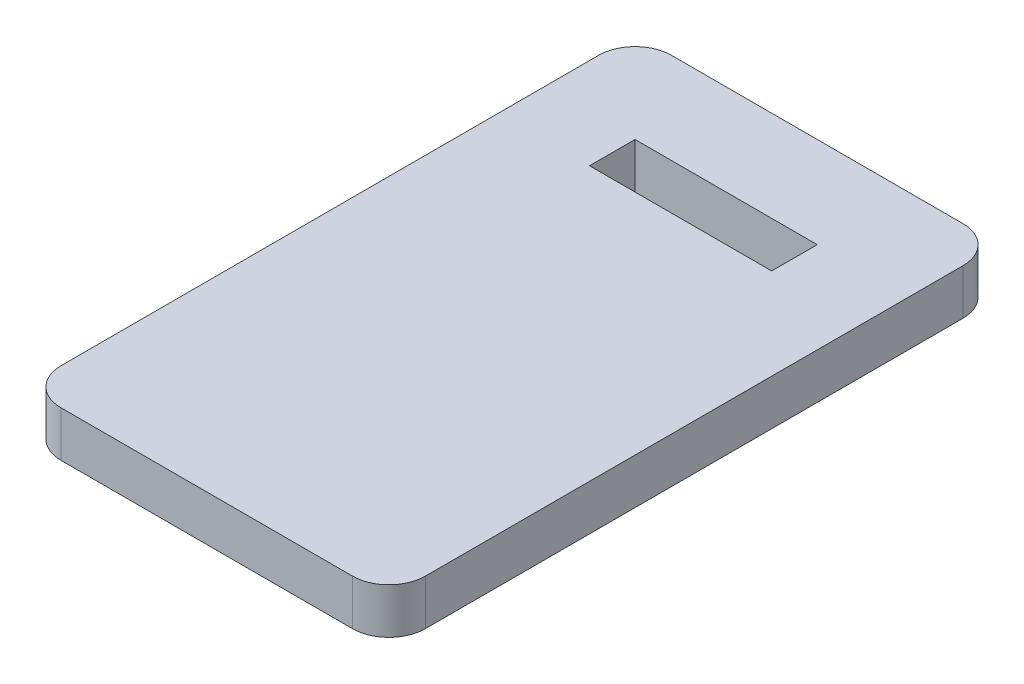
ISO-10303-21;
HEADER;
FILE_DESCRIPTION(('STEP AP214'),'2;1');
FILE_NAME('part.step','',(''),(''),'','','');
FILE_SCHEMA(('AUTOMOTIVE_DESIGN { 1 0 10303 214 1 1 1 1 }'));
ENDSEC;
DATA;
#1=APPLICATION_CONTEXT('core data for automotive mechanical design processes');
#2=APPLICATION_PROTOCOL_DEFINITION('international standard','automotive_design',2000,#1);
#3=PRODUCT_CONTEXT('',#1,'mechanical');
#4=PRODUCT('Part','Part','',(#3));
#5=PRODUCT_RELATED_PRODUCT_CATEGORY('part','',(#4));
#6=PRODUCT_DEFINITION_FORMATION('','',#4);
#7=PRODUCT_DEFINITION_CONTEXT('part definition',#1,'design');
#8=PRODUCT_DEFINITION('design','',#6,#7);
#9=PRODUCT_DEFINITION_SHAPE('','',#8);
#10=(LENGTH_UNIT() NAMED_UNIT(*) SI_UNIT(.MILLI.,.METRE.));
#11=(NAMED_UNIT(*) PLANE_ANGLE_UNIT() SI_UNIT($,.RADIAN.));
#12=(NAMED_UNIT(*) SI_UNIT($,.STERADIAN.) SOLID_ANGLE_UNIT());
#13=UNCERTAINTY_MEASURE_WITH_UNIT(LENGTH_MEASURE(1.E-05),#10,'distance_accuracy_value','');
#14=(GEOMETRIC_REPRESENTATION_CONTEXT(3) GLOBAL_UNCERTAINTY_ASSIGNED_CONTEXT((#13)) GLOBAL_UNIT_ASSIGNED_CONTEXT((#10,
#11,#12)) REPRESENTATION_CONTEXT('',''));
#15=CARTESIAN_POINT('',(0.,0.,0.));
#16=DIRECTION('',(0.,0.,1.));
#17=DIRECTION('',(1.,0.,0.));
#18=AXIS2_PLACEMENT_3D('',#15,#16,#17);
#19=CARTESIAN_POINT('',(0.,3.175,0.));
#20=DIRECTION('',(1.,0.,0.));
#21=DIRECTION('',(0.,0.,-1.));
#22=AXIS2_PLACEMENT_3D('',#19,#20,#21);
#23=PLANE('',#22);
#24=DIRECTION('',(0.,0.,1.));
#25=VECTOR('',#24,1.);
#26=CARTESIAN_POINT('',(0.,3.175,0.));
#27=LINE('',#26,#25);
#28=CARTESIAN_POINT('',(0.,3.175,-40.015));
#29=VERTEX_POINT('',#28);
#30=CARTESIAN_POINT('',(0.,3.175,-2.54));
#31=VERTEX_POINT('',#30);
#32=EDGE_CURVE('E190',#29,#31,#27,.T.);
#33=ORIENTED_EDGE('',*,*,#32,.F.);
#34=DIRECTION('',(0.,-1.,0.));
#35=VECTOR('',#34,1.);
#36=CARTESIAN_POINT('',(0.,3.175,-40.015));
#37=LINE('',#36,#35);
#38=CARTESIAN_POINT('',(0.,0.,-40.015));
#39=VERTEX_POINT('',#38);
#40=EDGE_CURVE('E221',#29,#39,#37,.T.);
#41=ORIENTED_EDGE('',*,*,#40,.T.);
#42=DIRECTION('',(0.,0.,1.));
#43=VECTOR('',#42,1.);
#44=CARTESIAN_POINT('',(0.,0.,0.));
#45=LINE('',#44,#43);
#46=CARTESIAN_POINT('',(0.,0.,-2.54));
#47=VERTEX_POINT('',#46);
#48=EDGE_CURVE('E184',#39,#47,#45,.T.);
#49=ORIENTED_EDGE('',*,*,#48,.T.);
#50=DIRECTION('',(0.,-1.,0.));
#51=VECTOR('',#50,1.);
#52=CARTESIAN_POINT('',(0.,3.175,-2.54));
#53=LINE('',#52,#51);
#54=EDGE_CURVE('E205',#47,#31,#53,.F.);
#55=ORIENTED_EDGE('',*,*,#54,.T.);
#56=EDGE_LOOP('',(#33,#41,#49,#55));
#57=FACE_BOUND('',#56,.T.);
#58=ADVANCED_FACE('F43',(#57),#23,.F.);
#59=CARTESIAN_POINT('',(0.,3.175,0.));
#60=DIRECTION('',(0.,0.,-1.));
#61=DIRECTION('',(-1.,0.,0.));
#62=AXIS2_PLACEMENT_3D('',#59,#60,#61);
#63=PLANE('',#62);
#64=DIRECTION('',(1.,0.,0.));
#65=VECTOR('',#64,1.);
#66=CARTESIAN_POINT('',(0.,0.,0.));
#67=LINE('',#66,#65);
#68=CARTESIAN_POINT('',(2.54,0.,0.));
#69=VERTEX_POINT('',#68);
#70=CARTESIAN_POINT('',(22.86,0.,0.));
#71=VERTEX_POINT('',#70);
#72=EDGE_CURVE('E209',#69,#71,#67,.T.);
#73=ORIENTED_EDGE('',*,*,#72,.T.);
#74=DIRECTION('',(0.,-1.,0.));
#75=VECTOR('',#74,1.);
#76=CARTESIAN_POINT('',(22.86,3.175,0.));
#77=LINE('',#76,#75);
#78=CARTESIAN_POINT('',(22.86,3.175,0.));
#79=VERTEX_POINT('',#78);
#80=EDGE_CURVE('E11',#71,#79,#77,.F.);
#81=ORIENTED_EDGE('',*,*,#80,.T.);
#82=DIRECTION('',(1.,0.,0.));
#83=VECTOR('',#82,1.);
#84=CARTESIAN_POINT('',(0.,3.175,0.));
#85=LINE('',#84,#83);
#86=CARTESIAN_POINT('',(2.54,3.175,0.));
#87=VERTEX_POINT('',#86);
#88=EDGE_CURVE('E194',#87,#79,#85,.T.);
#89=ORIENTED_EDGE('',*,*,#88,.F.);
#90=DIRECTION('',(0.,-1.,0.));
#91=VECTOR('',#90,1.);
#92=CARTESIAN_POINT('',(2.54,3.175,0.));
#93=LINE('',#92,#91);
#94=EDGE_CURVE('E52',#87,#69,#93,.T.);
#95=ORIENTED_EDGE('',*,*,#94,.T.);
#96=EDGE_LOOP('',(#73,#81,#89,#95));
#97=FACE_BOUND('',#96,.T.);
#98=ADVANCED_FACE('F266',(#97),#63,.F.);
#99=CARTESIAN_POINT('',(25.4,3.175,0.));
#100=DIRECTION('',(-1.,0.,0.));
#101=DIRECTION('',(0.,0.,1.));
#102=AXIS2_PLACEMENT_3D('',#99,#100,#101);
#103=PLANE('',#102);
#104=DIRECTION('',(0.,0.,-1.));
#105=VECTOR('',#104,1.);
#106=CARTESIAN_POINT('',(25.4,0.,0.));
#107=LINE('',#106,#105);
#108=CARTESIAN_POINT('',(25.4,0.,-2.54));
#109=VERTEX_POINT('',#108);
#110=CARTESIAN_POINT('',(25.4,0.,-40.015));
#111=VERTEX_POINT('',#110);
#112=EDGE_CURVE('E213',#109,#111,#107,.T.);
#113=ORIENTED_EDGE('',*,*,#112,.T.);
#114=DIRECTION('',(0.,-1.,0.));
#115=VECTOR('',#114,1.);
#116=CARTESIAN_POINT('',(25.4,3.175,-40.015));
#117=LINE('',#116,#115);
#118=CARTESIAN_POINT('',(25.4,3.175,-40.015));
#119=VERTEX_POINT('',#118);
#120=EDGE_CURVE('E59',#111,#119,#117,.F.);
#121=ORIENTED_EDGE('',*,*,#120,.T.);
#122=DIRECTION('',(0.,0.,-1.));
#123=VECTOR('',#122,1.);
#124=CARTESIAN_POINT('',(25.4,3.175,0.));
#125=LINE('',#124,#123);
#126=CARTESIAN_POINT('',(25.4,3.175,-2.54));
#127=VERTEX_POINT('',#126);
#128=EDGE_CURVE('E198',#127,#119,#125,.T.);
#129=ORIENTED_EDGE('',*,*,#128,.F.);
#130=DIRECTION('',(0.,-1.,0.));
#131=VECTOR('',#130,1.);
#132=CARTESIAN_POINT('',(25.4,3.175,-2.54));
#133=LINE('',#132,#131);
#134=EDGE_CURVE('E255',#127,#109,#133,.T.);
#135=ORIENTED_EDGE('',*,*,#134,.T.);
#136=EDGE_LOOP('',(#113,#121,#129,#135));
#137=FACE_BOUND('',#136,.T.);
#138=ADVANCED_FACE('F275',(#137),#103,.F.);
#139=CARTESIAN_POINT('',(0.,3.175,-42.555));
#140=DIRECTION('',(0.,0.,1.));
#141=DIRECTION('',(1.,0.,0.));
#142=AXIS2_PLACEMENT_3D('',#139,#140,#141);
#143=PLANE('',#142);
#144=DIRECTION('',(-1.,0.,0.));
#145=VECTOR('',#144,1.);
#146=CARTESIAN_POINT('',(0.,0.,-42.555));
#147=LINE('',#146,#145);
#148=CARTESIAN_POINT('',(22.86,0.,-42.555));
#149=VERTEX_POINT('',#148);
#150=CARTESIAN_POINT('',(2.54,0.,-42.555));
#151=VERTEX_POINT('',#150);
#152=EDGE_CURVE('E195',#149,#151,#147,.T.);
#153=ORIENTED_EDGE('',*,*,#152,.T.);
#154=DIRECTION('',(0.,-1.,0.));
#155=VECTOR('',#154,1.);
#156=CARTESIAN_POINT('',(2.54,3.175,-42.555));
#157=LINE('',#156,#155);
#158=CARTESIAN_POINT('',(2.54,3.175,-42.555));
#159=VERTEX_POINT('',#158);
#160=EDGE_CURVE('E241',#151,#159,#157,.F.);
#161=ORIENTED_EDGE('',*,*,#160,.T.);
#162=DIRECTION('',(-1.,0.,0.));
#163=VECTOR('',#162,1.);
#164=CARTESIAN_POINT('',(0.,3.175,-42.555));
#165=LINE('',#164,#163);
#166=CARTESIAN_POINT('',(22.86,3.175,-42.555));
#167=VERTEX_POINT('',#166);
#168=EDGE_CURVE('E201',#167,#159,#165,.T.);
#169=ORIENTED_EDGE('',*,*,#168,.F.);
#170=DIRECTION('',(0.,-1.,0.));
#171=VECTOR('',#170,1.);
#172=CARTESIAN_POINT('',(22.86,3.175,-42.555));
#173=LINE('',#172,#171);
#174=EDGE_CURVE('E237',#167,#149,#173,.T.);
#175=ORIENTED_EDGE('',*,*,#174,.T.);
#176=EDGE_LOOP('',(#153,#161,#169,#175));
#177=FACE_BOUND('',#176,.T.);
#178=ADVANCED_FACE('F284',(#177),#143,.F.);
#179=CARTESIAN_POINT('',(0.,3.175,0.));
#180=DIRECTION('',(0.,-1.,0.));
#181=DIRECTION('',(0.,0.,-1.));
#182=AXIS2_PLACEMENT_3D('',#179,#180,#181);
#183=PLANE('',#182);
#184=DIRECTION('',(1.,0.,0.));
#185=VECTOR('',#184,1.);
#186=CARTESIAN_POINT('',(6.35,3.175,-33.03));
#187=LINE('',#186,#185);
#188=CARTESIAN_POINT('',(6.35,3.175,-33.03));
#189=VERTEX_POINT('',#188);
#190=CARTESIAN_POINT('',(19.05,3.175,-33.03));
#191=VERTEX_POINT('',#190);
#192=EDGE_CURVE('E175',#189,#191,#187,.T.);
#193=ORIENTED_EDGE('',*,*,#192,.F.);
#194=DIRECTION('',(0.,0.,1.));
#195=VECTOR('',#194,1.);
#196=CARTESIAN_POINT('',(6.35,3.175,-33.03));
#197=LINE('',#196,#195);
#198=CARTESIAN_POINT('',(6.35,3.175,-36.205));
#199=VERTEX_POINT('',#198);
#200=EDGE_CURVE('E141',#199,#189,#197,.T.);
#201=ORIENTED_EDGE('',*,*,#200,.F.);
#202=DIRECTION('',(-1.,0.,0.));
#203=VECTOR('',#202,1.);
#204=CARTESIAN_POINT('',(6.35,3.175,-36.205));
#205=LINE('',#204,#203);
#206=CARTESIAN_POINT('',(19.05,3.175,-36.205));
#207=VERTEX_POINT('',#206);
#208=EDGE_CURVE('E162',#207,#199,#205,.T.);
#209=ORIENTED_EDGE('',*,*,#208,.F.);
#210=DIRECTION('',(0.,0.,-1.));
#211=VECTOR('',#210,1.);
#212=CARTESIAN_POINT('',(19.05,3.175,-33.03));
#213=LINE('',#212,#211);
#214=EDGE_CURVE('E166',#191,#207,#213,.T.);
#215=ORIENTED_EDGE('',*,*,#214,.F.);
#216=EDGE_LOOP('',(#193,#201,#209,#215));
#217=FACE_BOUND('',#216,.T.);
#218=ORIENTED_EDGE('',*,*,#168,.T.);
#219=CARTESIAN_POINT('',(2.54,3.175,-40.015));
#220=DIRECTION('',(0.,-1.,0.));
#221=DIRECTION('',(0.,0.,-1.));
#222=AXIS2_PLACEMENT_3D('',#219,#220,#221);
#223=CIRCLE('',#222,2.54);
#224=EDGE_CURVE('E252',#159,#29,#223,.F.);
#225=ORIENTED_EDGE('',*,*,#224,.T.);
#226=ORIENTED_EDGE('',*,*,#32,.T.);
#227=CARTESIAN_POINT('',(2.54,3.175,-2.54));
#228=DIRECTION('',(0.,-1.,0.));
#229=DIRECTION('',(0.,0.,-1.));
#230=AXIS2_PLACEMENT_3D('',#227,#228,#229);
#231=CIRCLE('',#230,2.54);
#232=EDGE_CURVE('E244',#31,#87,#231,.F.);
#233=ORIENTED_EDGE('',*,*,#232,.T.);
#234=ORIENTED_EDGE('',*,*,#88,.T.);
#235=CARTESIAN_POINT('',(22.86,3.175,-2.54));
#236=DIRECTION('',(0.,-1.,0.));
#237=DIRECTION('',(0.,0.,-1.));
#238=AXIS2_PLACEMENT_3D('',#235,#236,#237);
#239=CIRCLE('',#238,2.54);
#240=EDGE_CURVE('E66',#79,#127,#239,.F.);
#241=ORIENTED_EDGE('',*,*,#240,.T.);
#242=ORIENTED_EDGE('',*,*,#128,.T.);
#243=CARTESIAN_POINT('',(22.86,3.175,-40.015));
#244=DIRECTION('',(0.,-1.,0.));
#245=DIRECTION('',(0.,0.,-1.));
#246=AXIS2_PLACEMENT_3D('',#243,#244,#245);
#247=CIRCLE('',#246,2.54);
#248=EDGE_CURVE('E249',#119,#167,#247,.F.);
#249=ORIENTED_EDGE('',*,*,#248,.T.);
#250=EDGE_LOOP('',(#218,#225,#226,#233,#234,#241,#242,#249));
#251=FACE_BOUND('',#250,.T.);
#252=ADVANCED_FACE('F277',(#217,#251),#183,.F.);
#253=CARTESIAN_POINT('',(0.,0.,0.));
#254=DIRECTION('',(0.,-1.,0.));
#255=DIRECTION('',(0.,0.,-1.));
#256=AXIS2_PLACEMENT_3D('',#253,#254,#255);
#257=PLANE('',#256);
#258=DIRECTION('',(0.,0.,1.));
#259=VECTOR('',#258,1.);
#260=CARTESIAN_POINT('',(6.35,0.,-33.03));
#261=LINE('',#260,#259);
#262=CARTESIAN_POINT('',(6.35,0.,-36.205));
#263=VERTEX_POINT('',#262);
#264=CARTESIAN_POINT('',(6.35,0.,-33.03));
#265=VERTEX_POINT('',#264);
#266=EDGE_CURVE('E138',#263,#265,#261,.T.);
#267=ORIENTED_EDGE('',*,*,#266,.T.);
#268=DIRECTION('',(1.,0.,0.));
#269=VECTOR('',#268,1.);
#270=CARTESIAN_POINT('',(6.35,0.,-33.03));
#271=LINE('',#270,#269);
#272=CARTESIAN_POINT('',(19.05,0.,-33.03));
#273=VERTEX_POINT('',#272);
#274=EDGE_CURVE('E151',#265,#273,#271,.T.);
#275=ORIENTED_EDGE('',*,*,#274,.T.);
#276=DIRECTION('',(0.,0.,-1.));
#277=VECTOR('',#276,1.);
#278=CARTESIAN_POINT('',(19.05,0.,-33.03));
#279=LINE('',#278,#277);
#280=CARTESIAN_POINT('',(19.05,0.,-36.205));
#281=VERTEX_POINT('',#280);
#282=EDGE_CURVE('E156',#273,#281,#279,.T.);
#283=ORIENTED_EDGE('',*,*,#282,.T.);
#284=DIRECTION('',(-1.,0.,0.));
#285=VECTOR('',#284,1.);
#286=CARTESIAN_POINT('',(6.35,0.,-36.205));
#287=LINE('',#286,#285);
#288=EDGE_CURVE('E147',#281,#263,#287,.T.);
#289=ORIENTED_EDGE('',*,*,#288,.T.);
#290=EDGE_LOOP('',(#267,#275,#283,#289));
#291=FACE_BOUND('',#290,.T.);
#292=ORIENTED_EDGE('',*,*,#48,.F.);
#293=CARTESIAN_POINT('',(2.54,0.,-40.015));
#294=DIRECTION('',(0.,-1.,0.));
#295=DIRECTION('',(0.,0.,-1.));
#296=AXIS2_PLACEMENT_3D('',#293,#294,#295);
#297=CIRCLE('',#296,2.54);
#298=EDGE_CURVE('E234',#39,#151,#297,.T.);
#299=ORIENTED_EDGE('',*,*,#298,.T.);
#300=ORIENTED_EDGE('',*,*,#152,.F.);
#301=CARTESIAN_POINT('',(22.86,0.,-40.015));
#302=DIRECTION('',(0.,-1.,0.));
#303=DIRECTION('',(0.,0.,-1.));
#304=AXIS2_PLACEMENT_3D('',#301,#302,#303);
#305=CIRCLE('',#304,2.54);
#306=EDGE_CURVE('E231',#149,#111,#305,.T.);
#307=ORIENTED_EDGE('',*,*,#306,.T.);
#308=ORIENTED_EDGE('',*,*,#112,.F.);
#309=CARTESIAN_POINT('',(22.86,0.,-2.54));
#310=DIRECTION('',(0.,-1.,0.));
#311=DIRECTION('',(0.,0.,-1.));
#312=AXIS2_PLACEMENT_3D('',#309,#310,#311);
#313=CIRCLE('',#312,2.54);
#314=EDGE_CURVE('E228',#109,#71,#313,.T.);
#315=ORIENTED_EDGE('',*,*,#314,.T.);
#316=ORIENTED_EDGE('',*,*,#72,.F.);
#317=CARTESIAN_POINT('',(2.54,0.,-2.54));
#318=DIRECTION('',(0.,-1.,0.));
#319=DIRECTION('',(0.,0.,-1.));
#320=AXIS2_PLACEMENT_3D('',#317,#318,#319);
#321=CIRCLE('',#320,2.54);
#322=EDGE_CURVE('E225',#69,#47,#321,.T.);
#323=ORIENTED_EDGE('',*,*,#322,.T.);
#324=EDGE_LOOP('',(#292,#299,#300,#307,#308,#315,#316,#323));
#325=FACE_BOUND('',#324,.T.);
#326=ADVANCED_FACE('F158',(#291,#325),#257,.T.);
#327=CARTESIAN_POINT('',(6.35,0.,-33.03));
#328=DIRECTION('',(-1.,0.,0.));
#329=DIRECTION('',(0.,0.,1.));
#330=AXIS2_PLACEMENT_3D('',#327,#328,#329);
#331=PLANE('',#330);
#332=ORIENTED_EDGE('',*,*,#200,.T.);
#333=DIRECTION('',(0.,1.,0.));
#334=VECTOR('',#333,1.);
#335=CARTESIAN_POINT('',(6.35,0.,-33.03));
#336=LINE('',#335,#334);
#337=EDGE_CURVE('E134',#265,#189,#336,.T.);
#338=ORIENTED_EDGE('',*,*,#337,.F.);
#339=ORIENTED_EDGE('',*,*,#266,.F.);
#340=DIRECTION('',(0.,1.,0.));
#341=VECTOR('',#340,1.);
#342=CARTESIAN_POINT('',(6.35,0.,-36.205));
#343=LINE('',#342,#341);
#344=EDGE_CURVE('E181',#263,#199,#343,.T.);
#345=ORIENTED_EDGE('',*,*,#344,.T.);
#346=EDGE_LOOP('',(#332,#338,#339,#345));
#347=FACE_BOUND('',#346,.T.);
#348=ADVANCED_FACE('F136',(#347),#331,.F.);
#349=CARTESIAN_POINT('',(6.35,0.,-36.205));
#350=DIRECTION('',(0.,0.,-1.));
#351=DIRECTION('',(-1.,0.,0.));
#352=AXIS2_PLACEMENT_3D('',#349,#350,#351);
#353=PLANE('',#352);
#354=ORIENTED_EDGE('',*,*,#208,.T.);
#355=ORIENTED_EDGE('',*,*,#344,.F.);
#356=ORIENTED_EDGE('',*,*,#288,.F.);
#357=DIRECTION('',(0.,1.,0.));
#358=VECTOR('',#357,1.);
#359=CARTESIAN_POINT('',(19.05,0.,-36.205));
#360=LINE('',#359,#358);
#361=EDGE_CURVE('E185',#281,#207,#360,.T.);
#362=ORIENTED_EDGE('',*,*,#361,.T.);
#363=EDGE_LOOP('',(#354,#355,#356,#362));
#364=FACE_BOUND('',#363,.T.);
#365=ADVANCED_FACE('F351',(#364),#353,.F.);
#366=CARTESIAN_POINT('',(19.05,0.,-33.03));
#367=DIRECTION('',(1.,0.,0.));
#368=DIRECTION('',(0.,0.,-1.));
#369=AXIS2_PLACEMENT_3D('',#366,#367,#368);
#370=PLANE('',#369);
#371=ORIENTED_EDGE('',*,*,#214,.T.);
#372=ORIENTED_EDGE('',*,*,#361,.F.);
#373=ORIENTED_EDGE('',*,*,#282,.F.);
#374=DIRECTION('',(0.,1.,0.));
#375=VECTOR('',#374,1.);
#376=CARTESIAN_POINT('',(19.05,0.,-33.03));
#377=LINE('',#376,#375);
#378=EDGE_CURVE('E146',#273,#191,#377,.T.);
#379=ORIENTED_EDGE('',*,*,#378,.T.);
#380=EDGE_LOOP('',(#371,#372,#373,#379));
#381=FACE_BOUND('',#380,.T.);
#382=ADVANCED_FACE('F342',(#381),#370,.F.);
#383=CARTESIAN_POINT('',(6.35,0.,-33.03));
#384=DIRECTION('',(0.,0.,1.));
#385=DIRECTION('',(1.,0.,0.));
#386=AXIS2_PLACEMENT_3D('',#383,#384,#385);
#387=PLANE('',#386);
#388=ORIENTED_EDGE('',*,*,#192,.T.);
#389=ORIENTED_EDGE('',*,*,#378,.F.);
#390=ORIENTED_EDGE('',*,*,#274,.F.);
#391=ORIENTED_EDGE('',*,*,#337,.T.);
#392=EDGE_LOOP('',(#388,#389,#390,#391));
#393=FACE_BOUND('',#392,.T.);
#394=ADVANCED_FACE('F152',(#393),#387,.F.);
#395=CARTESIAN_POINT('',(2.54,3.175,-40.015));
#396=DIRECTION('',(0.,-1.,0.));
#397=DIRECTION('',(0.,0.,-1.));
#398=AXIS2_PLACEMENT_3D('',#395,#396,#397);
#399=CYLINDRICAL_SURFACE('',#398,2.54);
#400=ORIENTED_EDGE('',*,*,#224,.F.);
#401=ORIENTED_EDGE('',*,*,#160,.F.);
#402=ORIENTED_EDGE('',*,*,#298,.F.);
#403=ORIENTED_EDGE('',*,*,#40,.F.);
#404=EDGE_LOOP('',(#400,#401,#402,#403));
#405=FACE_BOUND('',#404,.T.);
#406=ADVANCED_FACE('F289',(#405),#399,.T.);
#407=CARTESIAN_POINT('',(22.86,3.175,-40.015));
#408=DIRECTION('',(0.,-1.,0.));
#409=DIRECTION('',(0.,0.,-1.));
#410=AXIS2_PLACEMENT_3D('',#407,#408,#409);
#411=CYLINDRICAL_SURFACE('',#410,2.54);
#412=ORIENTED_EDGE('',*,*,#248,.F.);
#413=ORIENTED_EDGE('',*,*,#120,.F.);
#414=ORIENTED_EDGE('',*,*,#306,.F.);
#415=ORIENTED_EDGE('',*,*,#174,.F.);
#416=EDGE_LOOP('',(#412,#413,#414,#415));
#417=FACE_BOUND('',#416,.T.);
#418=ADVANCED_FACE('F281',(#417),#411,.T.);
#419=CARTESIAN_POINT('',(22.86,3.175,-2.54));
#420=DIRECTION('',(0.,-1.,0.));
#421=DIRECTION('',(0.,0.,-1.));
#422=AXIS2_PLACEMENT_3D('',#419,#420,#421);
#423=CYLINDRICAL_SURFACE('',#422,2.54);
#424=ORIENTED_EDGE('',*,*,#240,.F.);
#425=ORIENTED_EDGE('',*,*,#80,.F.);
#426=ORIENTED_EDGE('',*,*,#314,.F.);
#427=ORIENTED_EDGE('',*,*,#134,.F.);
#428=EDGE_LOOP('',(#424,#425,#426,#427));
#429=FACE_BOUND('',#428,.T.);
#430=ADVANCED_FACE('F274',(#429),#423,.T.);
#431=CARTESIAN_POINT('',(2.54,3.175,-2.54));
#432=DIRECTION('',(0.,-1.,0.));
#433=DIRECTION('',(0.,0.,-1.));
#434=AXIS2_PLACEMENT_3D('',#431,#432,#433);
#435=CYLINDRICAL_SURFACE('',#434,2.54);
#436=ORIENTED_EDGE('',*,*,#232,.F.);
#437=ORIENTED_EDGE('',*,*,#54,.F.);
#438=ORIENTED_EDGE('',*,*,#322,.F.);
#439=ORIENTED_EDGE('',*,*,#94,.F.);
#440=EDGE_LOOP('',(#436,#437,#438,#439));
#441=FACE_BOUND('',#440,.T.);
#442=ADVANCED_FACE('F45',(#441),#435,.T.);
#443=CLOSED_SHELL('',(#58,#98,#138,#178,#252,#326,#348,#365,#382,#394,#406,#418,#430,#442));
#444=MANIFOLD_SOLID_BREP('B2',#443);
#445=ADVANCED_BREP_SHAPE_REPRESENTATION('',(#18,#444),#14);
#446=SHAPE_DEFINITION_REPRESENTATION(#9,#445);
ENDSEC;
END-ISO-10303-21;
